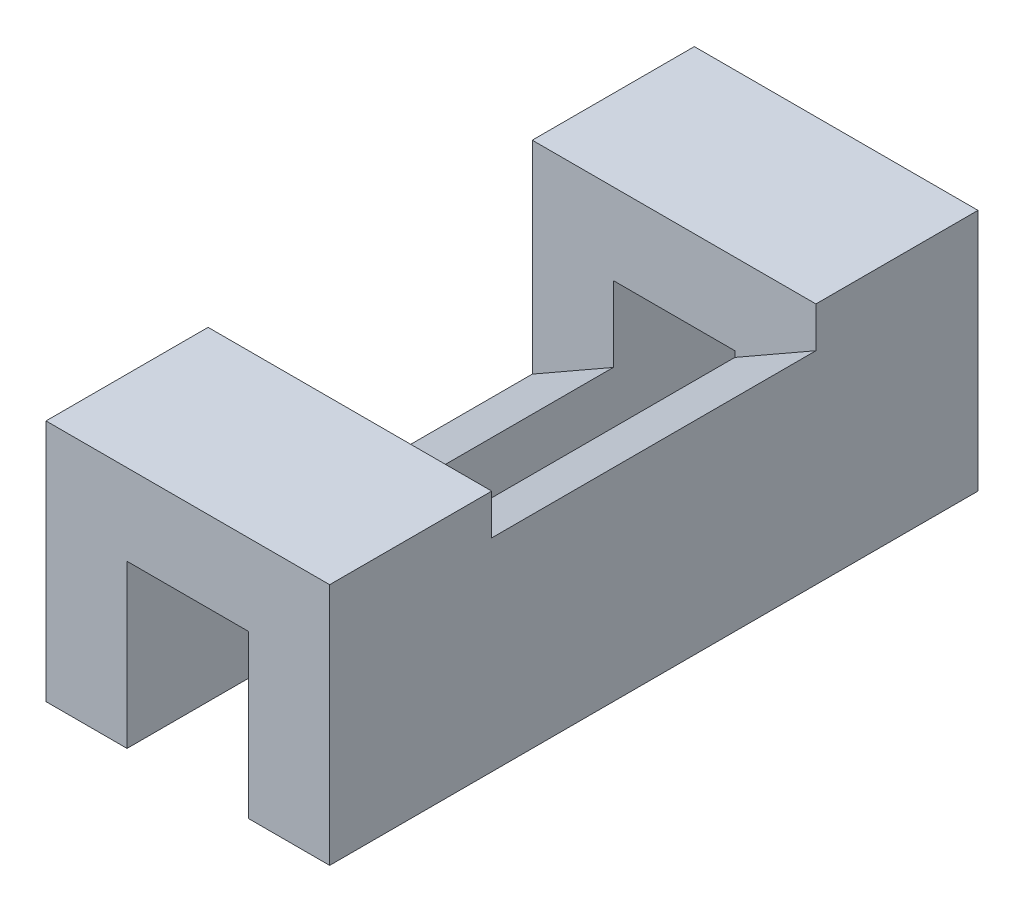
ISO-10303-21;
HEADER;
FILE_DESCRIPTION(('STEP AP214'),'2;1');
FILE_NAME('part.step','',(''),(''),'','','');
FILE_SCHEMA(('AUTOMOTIVE_DESIGN { 1 0 10303 214 1 1 1 1 }'));
ENDSEC;
DATA;
#1=APPLICATION_CONTEXT('core data for automotive mechanical design processes');
#2=APPLICATION_PROTOCOL_DEFINITION('international standard','automotive_design',2000,#1);
#3=PRODUCT_CONTEXT('',#1,'mechanical');
#4=PRODUCT('Part','Part','',(#3));
#5=PRODUCT_RELATED_PRODUCT_CATEGORY('part','',(#4));
#6=PRODUCT_DEFINITION_FORMATION('','',#4);
#7=PRODUCT_DEFINITION_CONTEXT('part definition',#1,'design');
#8=PRODUCT_DEFINITION('design','',#6,#7);
#9=PRODUCT_DEFINITION_SHAPE('','',#8);
#10=(LENGTH_UNIT() NAMED_UNIT(*) SI_UNIT(.MILLI.,.METRE.));
#11=(NAMED_UNIT(*) PLANE_ANGLE_UNIT() SI_UNIT($,.RADIAN.));
#12=(NAMED_UNIT(*) SI_UNIT($,.STERADIAN.) SOLID_ANGLE_UNIT());
#13=UNCERTAINTY_MEASURE_WITH_UNIT(LENGTH_MEASURE(1.E-05),#10,'distance_accuracy_value','');
#14=(GEOMETRIC_REPRESENTATION_CONTEXT(3) GLOBAL_UNCERTAINTY_ASSIGNED_CONTEXT((#13)) GLOBAL_UNIT_ASSIGNED_CONTEXT((#10,
#11,#12)) REPRESENTATION_CONTEXT('',''));
#15=CARTESIAN_POINT('',(0.,0.,0.));
#16=DIRECTION('',(0.,0.,1.));
#17=DIRECTION('',(1.,0.,0.));
#18=AXIS2_PLACEMENT_3D('',#15,#16,#17);
#19=CARTESIAN_POINT('',(-25.,10.7142857142857,20.));
#20=DIRECTION('',(0.496138938356834,-0.868243142124459,0.));
#21=DIRECTION('',(0.868243142124459,0.496138938356834,0.));
#22=AXIS2_PLACEMENT_3D('',#19,#20,#21);
#23=PLANE('',#22);
#24=DIRECTION('',(0.868243142124459,0.496138938356834,0.));
#25=VECTOR('',#24,1.);
#26=CARTESIAN_POINT('',(-25.,10.7142857142857,60.));
#27=LINE('',#26,#25);
#28=CARTESIAN_POINT('',(-35.,5.,60.));
#29=VERTEX_POINT('',#28);
#30=CARTESIAN_POINT('',(-25.,10.7142857142857,60.));
#31=VERTEX_POINT('',#30);
#32=EDGE_CURVE('E52',#29,#31,#27,.T.);
#33=ORIENTED_EDGE('',*,*,#32,.T.);
#34=DIRECTION('',(0.,0.,1.));
#35=VECTOR('',#34,1.);
#36=CARTESIAN_POINT('',(-25.,10.7142857142857,20.));
#37=LINE('',#36,#35);
#38=CARTESIAN_POINT('',(-25.,10.7142857142857,20.));
#39=VERTEX_POINT('',#38);
#40=EDGE_CURVE('E169',#39,#31,#37,.T.);
#41=ORIENTED_EDGE('',*,*,#40,.F.);
#42=DIRECTION('',(0.868243142124459,0.496138938356834,0.));
#43=VECTOR('',#42,1.);
#44=CARTESIAN_POINT('',(-25.,10.7142857142857,20.));
#45=LINE('',#44,#43);
#46=CARTESIAN_POINT('',(-35.,5.,20.));
#47=VERTEX_POINT('',#46);
#48=EDGE_CURVE('E191',#47,#39,#45,.T.);
#49=ORIENTED_EDGE('',*,*,#48,.F.);
#50=DIRECTION('',(0.,0.,1.));
#51=VECTOR('',#50,1.);
#52=CARTESIAN_POINT('',(-35.,5.,20.));
#53=LINE('',#52,#51);
#54=EDGE_CURVE('E48',#47,#29,#53,.T.);
#55=ORIENTED_EDGE('',*,*,#54,.T.);
#56=EDGE_LOOP('',(#33,#41,#49,#55));
#57=FACE_BOUND('',#56,.T.);
#58=ADVANCED_FACE('F33',(#57),#23,.F.);
#59=CARTESIAN_POINT('',(-9.99999999999999,19.2857142857143,20.));
#60=DIRECTION('',(0.496138938356834,-0.868243142124459,0.));
#61=DIRECTION('',(0.868243142124459,0.496138938356834,0.));
#62=AXIS2_PLACEMENT_3D('',#59,#60,#61);
#63=PLANE('',#62);
#64=DIRECTION('',(0.868243142124459,0.496138938356834,0.));
#65=VECTOR('',#64,1.);
#66=CARTESIAN_POINT('',(-9.99999999999999,19.2857142857143,60.));
#67=LINE('',#66,#65);
#68=CARTESIAN_POINT('',(-9.99999999999999,19.2857142857143,60.));
#69=VERTEX_POINT('',#68);
#70=CARTESIAN_POINT('',(0.,25.,60.));
#71=VERTEX_POINT('',#70);
#72=EDGE_CURVE('E175',#69,#71,#67,.T.);
#73=ORIENTED_EDGE('',*,*,#72,.T.);
#74=DIRECTION('',(0.,0.,1.));
#75=VECTOR('',#74,1.);
#76=CARTESIAN_POINT('',(0.,25.,20.));
#77=LINE('',#76,#75);
#78=CARTESIAN_POINT('',(0.,25.,20.));
#79=VERTEX_POINT('',#78);
#80=EDGE_CURVE('E217',#79,#71,#77,.T.);
#81=ORIENTED_EDGE('',*,*,#80,.F.);
#82=DIRECTION('',(0.868243142124459,0.496138938356834,0.));
#83=VECTOR('',#82,1.);
#84=CARTESIAN_POINT('',(-9.99999999999999,19.2857142857143,20.));
#85=LINE('',#84,#83);
#86=CARTESIAN_POINT('',(-9.99999999999999,19.2857142857143,20.));
#87=VERTEX_POINT('',#86);
#88=EDGE_CURVE('E205',#87,#79,#85,.T.);
#89=ORIENTED_EDGE('',*,*,#88,.F.);
#90=DIRECTION('',(0.,0.,1.));
#91=VECTOR('',#90,1.);
#92=CARTESIAN_POINT('',(-9.99999999999999,19.2857142857143,20.));
#93=LINE('',#92,#91);
#94=EDGE_CURVE('E220',#87,#69,#93,.T.);
#95=ORIENTED_EDGE('',*,*,#94,.T.);
#96=EDGE_LOOP('',(#73,#81,#89,#95));
#97=FACE_BOUND('',#96,.T.);
#98=ADVANCED_FACE('F289',(#97),#63,.F.);
#99=CARTESIAN_POINT('',(-25.,20.,80.));
#100=DIRECTION('',(0.,1.,0.));
#101=DIRECTION('',(0.,0.,1.));
#102=AXIS2_PLACEMENT_3D('',#99,#100,#101);
#103=PLANE('',#102);
#104=DIRECTION('',(1.,0.,0.));
#105=VECTOR('',#104,1.);
#106=CARTESIAN_POINT('',(-25.,20.,20.));
#107=LINE('',#106,#105);
#108=CARTESIAN_POINT('',(-25.,20.,20.));
#109=VERTEX_POINT('',#108);
#110=CARTESIAN_POINT('',(-9.99999999999999,20.,20.));
#111=VERTEX_POINT('',#110);
#112=EDGE_CURVE('E200',#109,#111,#107,.T.);
#113=ORIENTED_EDGE('',*,*,#112,.F.);
#114=DIRECTION('',(0.,0.,-1.));
#115=VECTOR('',#114,1.);
#116=CARTESIAN_POINT('',(-25.,20.,80.));
#117=LINE('',#116,#115);
#118=CARTESIAN_POINT('',(-25.,20.,0.));
#119=VERTEX_POINT('',#118);
#120=EDGE_CURVE('E267',#109,#119,#117,.T.);
#121=ORIENTED_EDGE('',*,*,#120,.T.);
#122=DIRECTION('',(1.,0.,0.));
#123=VECTOR('',#122,1.);
#124=CARTESIAN_POINT('',(-25.,20.,0.));
#125=LINE('',#124,#123);
#126=CARTESIAN_POINT('',(-9.99999999999999,20.,0.));
#127=VERTEX_POINT('',#126);
#128=EDGE_CURVE('E244',#119,#127,#125,.T.);
#129=ORIENTED_EDGE('',*,*,#128,.T.);
#130=DIRECTION('',(0.,0.,-1.));
#131=VECTOR('',#130,1.);
#132=CARTESIAN_POINT('',(-9.99999999999999,20.,80.));
#133=LINE('',#132,#131);
#134=EDGE_CURVE('E265',#111,#127,#133,.T.);
#135=ORIENTED_EDGE('',*,*,#134,.F.);
#136=EDGE_LOOP('',(#113,#121,#129,#135));
#137=FACE_BOUND('',#136,.T.);
#138=ADVANCED_FACE('F283',(#137),#103,.F.);
#139=CARTESIAN_POINT('',(0.,30.,80.));
#140=DIRECTION('',(0.,-1.,0.));
#141=DIRECTION('',(0.,0.,-1.));
#142=AXIS2_PLACEMENT_3D('',#139,#140,#141);
#143=PLANE('',#142);
#144=DIRECTION('',(-1.,0.,0.));
#145=VECTOR('',#144,1.);
#146=CARTESIAN_POINT('',(0.,30.,20.));
#147=LINE('',#146,#145);
#148=CARTESIAN_POINT('',(0.,30.,20.));
#149=VERTEX_POINT('',#148);
#150=CARTESIAN_POINT('',(-35.,30.,20.));
#151=VERTEX_POINT('',#150);
#152=EDGE_CURVE('E210',#149,#151,#147,.T.);
#153=ORIENTED_EDGE('',*,*,#152,.F.);
#154=DIRECTION('',(0.,0.,-1.));
#155=VECTOR('',#154,1.);
#156=CARTESIAN_POINT('',(0.,30.,80.));
#157=LINE('',#156,#155);
#158=CARTESIAN_POINT('',(0.,30.,0.));
#159=VERTEX_POINT('',#158);
#160=EDGE_CURVE('E257',#149,#159,#157,.T.);
#161=ORIENTED_EDGE('',*,*,#160,.T.);
#162=DIRECTION('',(-1.,0.,0.));
#163=VECTOR('',#162,1.);
#164=CARTESIAN_POINT('',(0.,30.,0.));
#165=LINE('',#164,#163);
#166=CARTESIAN_POINT('',(-35.,30.,0.));
#167=VERTEX_POINT('',#166);
#168=EDGE_CURVE('E226',#159,#167,#165,.T.);
#169=ORIENTED_EDGE('',*,*,#168,.T.);
#170=DIRECTION('',(0.,0.,-1.));
#171=VECTOR('',#170,1.);
#172=CARTESIAN_POINT('',(-35.,30.,80.));
#173=LINE('',#172,#171);
#174=EDGE_CURVE('E236',#151,#167,#173,.T.);
#175=ORIENTED_EDGE('',*,*,#174,.F.);
#176=EDGE_LOOP('',(#153,#161,#169,#175));
#177=FACE_BOUND('',#176,.T.);
#178=ADVANCED_FACE('F305',(#177),#143,.F.);
#179=CARTESIAN_POINT('',(-35.,30.,80.));
#180=DIRECTION('',(1.,0.,0.));
#181=DIRECTION('',(0.,0.,-1.));
#182=AXIS2_PLACEMENT_3D('',#179,#180,#181);
#183=PLANE('',#182);
#184=DIRECTION('',(0.,-1.,0.));
#185=VECTOR('',#184,1.);
#186=CARTESIAN_POINT('',(-35.,30.,80.));
#187=LINE('',#186,#185);
#188=CARTESIAN_POINT('',(-35.,30.,80.));
#189=VERTEX_POINT('',#188);
#190=CARTESIAN_POINT('',(-35.,0.,80.));
#191=VERTEX_POINT('',#190);
#192=EDGE_CURVE('E223',#189,#191,#187,.T.);
#193=ORIENTED_EDGE('',*,*,#192,.F.);
#194=DIRECTION('',(0.,0.,1.));
#195=VECTOR('',#194,1.);
#196=CARTESIAN_POINT('',(-35.,30.,60.));
#197=LINE('',#196,#195);
#198=CARTESIAN_POINT('',(-35.,30.,60.));
#199=VERTEX_POINT('',#198);
#200=EDGE_CURVE('E188',#199,#189,#197,.T.);
#201=ORIENTED_EDGE('',*,*,#200,.F.);
#202=DIRECTION('',(0.,-1.,0.));
#203=VECTOR('',#202,1.);
#204=CARTESIAN_POINT('',(-35.,30.,60.));
#205=LINE('',#204,#203);
#206=EDGE_CURVE('E156',#199,#29,#205,.T.);
#207=ORIENTED_EDGE('',*,*,#206,.T.);
#208=ORIENTED_EDGE('',*,*,#54,.F.);
#209=DIRECTION('',(0.,-1.,0.));
#210=VECTOR('',#209,1.);
#211=CARTESIAN_POINT('',(-35.,30.,20.));
#212=LINE('',#211,#210);
#213=EDGE_CURVE('E212',#151,#47,#212,.T.);
#214=ORIENTED_EDGE('',*,*,#213,.F.);
#215=ORIENTED_EDGE('',*,*,#174,.T.);
#216=DIRECTION('',(0.,-1.,0.));
#217=VECTOR('',#216,1.);
#218=CARTESIAN_POINT('',(-35.,30.,0.));
#219=LINE('',#218,#217);
#220=CARTESIAN_POINT('',(-35.,0.,0.));
#221=VERTEX_POINT('',#220);
#222=EDGE_CURVE('E216',#167,#221,#219,.T.);
#223=ORIENTED_EDGE('',*,*,#222,.T.);
#224=DIRECTION('',(0.,0.,-1.));
#225=VECTOR('',#224,1.);
#226=CARTESIAN_POINT('',(-35.,0.,80.));
#227=LINE('',#226,#225);
#228=EDGE_CURVE('E11',#191,#221,#227,.T.);
#229=ORIENTED_EDGE('',*,*,#228,.F.);
#230=EDGE_LOOP('',(#193,#201,#207,#208,#214,#215,#223,#229));
#231=FACE_BOUND('',#230,.T.);
#232=ADVANCED_FACE('F35',(#231),#183,.F.);
#233=CARTESIAN_POINT('',(-35.,0.,80.));
#234=DIRECTION('',(0.,1.,0.));
#235=DIRECTION('',(0.,0.,1.));
#236=AXIS2_PLACEMENT_3D('',#233,#234,#235);
#237=PLANE('',#236);
#238=DIRECTION('',(1.,0.,0.));
#239=VECTOR('',#238,1.);
#240=CARTESIAN_POINT('',(-35.,0.,0.));
#241=LINE('',#240,#239);
#242=CARTESIAN_POINT('',(-25.,0.,0.));
#243=VERTEX_POINT('',#242);
#244=EDGE_CURVE('E239',#221,#243,#241,.T.);
#245=ORIENTED_EDGE('',*,*,#244,.T.);
#246=DIRECTION('',(0.,0.,-1.));
#247=VECTOR('',#246,1.);
#248=CARTESIAN_POINT('',(-25.,0.,80.));
#249=LINE('',#248,#247);
#250=CARTESIAN_POINT('',(-25.,0.,80.));
#251=VERTEX_POINT('',#250);
#252=EDGE_CURVE('E41',#251,#243,#249,.T.);
#253=ORIENTED_EDGE('',*,*,#252,.F.);
#254=DIRECTION('',(1.,0.,0.));
#255=VECTOR('',#254,1.);
#256=CARTESIAN_POINT('',(-35.,0.,80.));
#257=LINE('',#256,#255);
#258=EDGE_CURVE('E225',#191,#251,#257,.T.);
#259=ORIENTED_EDGE('',*,*,#258,.F.);
#260=ORIENTED_EDGE('',*,*,#228,.T.);
#261=EDGE_LOOP('',(#245,#253,#259,#260));
#262=FACE_BOUND('',#261,.T.);
#263=ADVANCED_FACE('F323',(#262),#237,.F.);
#264=CARTESIAN_POINT('',(-25.,0.,80.));
#265=DIRECTION('',(-1.,0.,0.));
#266=DIRECTION('',(0.,0.,1.));
#267=AXIS2_PLACEMENT_3D('',#264,#265,#266);
#268=PLANE('',#267);
#269=DIRECTION('',(0.,1.,0.));
#270=VECTOR('',#269,1.);
#271=CARTESIAN_POINT('',(-25.,10.7142857142857,20.));
#272=LINE('',#271,#270);
#273=EDGE_CURVE('E198',#39,#109,#272,.T.);
#274=ORIENTED_EDGE('',*,*,#273,.F.);
#275=ORIENTED_EDGE('',*,*,#40,.T.);
#276=DIRECTION('',(0.,1.,0.));
#277=VECTOR('',#276,1.);
#278=CARTESIAN_POINT('',(-25.,10.7142857142857,60.));
#279=LINE('',#278,#277);
#280=CARTESIAN_POINT('',(-25.,20.,60.));
#281=VERTEX_POINT('',#280);
#282=EDGE_CURVE('E162',#31,#281,#279,.T.);
#283=ORIENTED_EDGE('',*,*,#282,.T.);
#284=DIRECTION('',(0.,0.,1.));
#285=VECTOR('',#284,1.);
#286=CARTESIAN_POINT('',(-25.,20.,60.));
#287=LINE('',#286,#285);
#288=CARTESIAN_POINT('',(-25.,20.,80.));
#289=VERTEX_POINT('',#288);
#290=EDGE_CURVE('E145',#281,#289,#287,.T.);
#291=ORIENTED_EDGE('',*,*,#290,.T.);
#292=DIRECTION('',(0.,1.,0.));
#293=VECTOR('',#292,1.);
#294=CARTESIAN_POINT('',(-25.,0.,80.));
#295=LINE('',#294,#293);
#296=EDGE_CURVE('E228',#251,#289,#295,.T.);
#297=ORIENTED_EDGE('',*,*,#296,.F.);
#298=ORIENTED_EDGE('',*,*,#252,.T.);
#299=DIRECTION('',(0.,1.,0.));
#300=VECTOR('',#299,1.);
#301=CARTESIAN_POINT('',(-25.,0.,0.));
#302=LINE('',#301,#300);
#303=EDGE_CURVE('E241',#243,#119,#302,.T.);
#304=ORIENTED_EDGE('',*,*,#303,.T.);
#305=ORIENTED_EDGE('',*,*,#120,.F.);
#306=EDGE_LOOP('',(#274,#275,#283,#291,#297,#298,#304,#305));
#307=FACE_BOUND('',#306,.T.);
#308=ADVANCED_FACE('F168',(#307),#268,.F.);
#309=CARTESIAN_POINT('',(-9.99999999999999,20.,80.));
#310=DIRECTION('',(1.,0.,0.));
#311=DIRECTION('',(0.,1.,0.));
#312=AXIS2_PLACEMENT_3D('',#309,#310,#311);
#313=PLANE('',#312);
#314=DIRECTION('',(0.,-1.,0.));
#315=VECTOR('',#314,1.);
#316=CARTESIAN_POINT('',(-9.99999999999999,20.,80.));
#317=LINE('',#316,#315);
#318=CARTESIAN_POINT('',(-9.99999999999999,20.,80.));
#319=VERTEX_POINT('',#318);
#320=CARTESIAN_POINT('',(-9.99999999999999,0.,80.));
#321=VERTEX_POINT('',#320);
#322=EDGE_CURVE('E230',#319,#321,#317,.T.);
#323=ORIENTED_EDGE('',*,*,#322,.F.);
#324=DIRECTION('',(0.,0.,1.));
#325=VECTOR('',#324,1.);
#326=CARTESIAN_POINT('',(-9.99999999999999,20.,60.));
#327=LINE('',#326,#325);
#328=CARTESIAN_POINT('',(-9.99999999999999,20.,60.));
#329=VERTEX_POINT('',#328);
#330=EDGE_CURVE('E155',#329,#319,#327,.T.);
#331=ORIENTED_EDGE('',*,*,#330,.F.);
#332=DIRECTION('',(0.,-1.,0.));
#333=VECTOR('',#332,1.);
#334=CARTESIAN_POINT('',(-9.99999999999999,20.,60.));
#335=LINE('',#334,#333);
#336=EDGE_CURVE('E165',#329,#69,#335,.T.);
#337=ORIENTED_EDGE('',*,*,#336,.T.);
#338=ORIENTED_EDGE('',*,*,#94,.F.);
#339=DIRECTION('',(0.,-1.,0.));
#340=VECTOR('',#339,1.);
#341=CARTESIAN_POINT('',(-9.99999999999999,20.,20.));
#342=LINE('',#341,#340);
#343=EDGE_CURVE('E202',#111,#87,#342,.T.);
#344=ORIENTED_EDGE('',*,*,#343,.F.);
#345=ORIENTED_EDGE('',*,*,#134,.T.);
#346=DIRECTION('',(0.,-1.,0.));
#347=VECTOR('',#346,1.);
#348=CARTESIAN_POINT('',(-9.99999999999999,20.,0.));
#349=LINE('',#348,#347);
#350=CARTESIAN_POINT('',(-9.99999999999999,0.,0.));
#351=VERTEX_POINT('',#350);
#352=EDGE_CURVE('E247',#127,#351,#349,.T.);
#353=ORIENTED_EDGE('',*,*,#352,.T.);
#354=DIRECTION('',(0.,0.,-1.));
#355=VECTOR('',#354,1.);
#356=CARTESIAN_POINT('',(-9.99999999999999,0.,80.));
#357=LINE('',#356,#355);
#358=EDGE_CURVE('E262',#321,#351,#357,.T.);
#359=ORIENTED_EDGE('',*,*,#358,.F.);
#360=EDGE_LOOP('',(#323,#331,#337,#338,#344,#345,#353,#359));
#361=FACE_BOUND('',#360,.T.);
#362=ADVANCED_FACE('F315',(#361),#313,.F.);
#363=CARTESIAN_POINT('',(-9.99999999999999,0.,80.));
#364=DIRECTION('',(0.,1.,0.));
#365=DIRECTION('',(0.,0.,1.));
#366=AXIS2_PLACEMENT_3D('',#363,#364,#365);
#367=PLANE('',#366);
#368=DIRECTION('',(1.,0.,0.));
#369=VECTOR('',#368,1.);
#370=CARTESIAN_POINT('',(-9.99999999999999,0.,0.));
#371=LINE('',#370,#369);
#372=CARTESIAN_POINT('',(0.,0.,0.));
#373=VERTEX_POINT('',#372);
#374=EDGE_CURVE('E249',#351,#373,#371,.T.);
#375=ORIENTED_EDGE('',*,*,#374,.T.);
#376=DIRECTION('',(0.,0.,-1.));
#377=VECTOR('',#376,1.);
#378=CARTESIAN_POINT('',(0.,0.,80.));
#379=LINE('',#378,#377);
#380=CARTESIAN_POINT('',(0.,0.,80.));
#381=VERTEX_POINT('',#380);
#382=EDGE_CURVE('E259',#381,#373,#379,.T.);
#383=ORIENTED_EDGE('',*,*,#382,.F.);
#384=DIRECTION('',(1.,0.,0.));
#385=VECTOR('',#384,1.);
#386=CARTESIAN_POINT('',(-9.99999999999999,0.,80.));
#387=LINE('',#386,#385);
#388=EDGE_CURVE('E232',#321,#381,#387,.T.);
#389=ORIENTED_EDGE('',*,*,#388,.F.);
#390=ORIENTED_EDGE('',*,*,#358,.T.);
#391=EDGE_LOOP('',(#375,#383,#389,#390));
#392=FACE_BOUND('',#391,.T.);
#393=ADVANCED_FACE('F311',(#392),#367,.F.);
#394=CARTESIAN_POINT('',(0.,0.,80.));
#395=DIRECTION('',(-1.,0.,0.));
#396=DIRECTION('',(0.,0.,1.));
#397=AXIS2_PLACEMENT_3D('',#394,#395,#396);
#398=PLANE('',#397);
#399=DIRECTION('',(0.,1.,0.));
#400=VECTOR('',#399,1.);
#401=CARTESIAN_POINT('',(0.,25.,20.));
#402=LINE('',#401,#400);
#403=EDGE_CURVE('E208',#79,#149,#402,.T.);
#404=ORIENTED_EDGE('',*,*,#403,.F.);
#405=ORIENTED_EDGE('',*,*,#80,.T.);
#406=DIRECTION('',(0.,1.,0.));
#407=VECTOR('',#406,1.);
#408=CARTESIAN_POINT('',(0.,25.,60.));
#409=LINE('',#408,#407);
#410=CARTESIAN_POINT('',(0.,30.,60.));
#411=VERTEX_POINT('',#410);
#412=EDGE_CURVE('E177',#71,#411,#409,.T.);
#413=ORIENTED_EDGE('',*,*,#412,.T.);
#414=DIRECTION('',(0.,0.,1.));
#415=VECTOR('',#414,1.);
#416=CARTESIAN_POINT('',(0.,30.,60.));
#417=LINE('',#416,#415);
#418=CARTESIAN_POINT('',(0.,30.,80.));
#419=VERTEX_POINT('',#418);
#420=EDGE_CURVE('E192',#411,#419,#417,.T.);
#421=ORIENTED_EDGE('',*,*,#420,.T.);
#422=DIRECTION('',(0.,1.,0.));
#423=VECTOR('',#422,1.);
#424=CARTESIAN_POINT('',(0.,0.,80.));
#425=LINE('',#424,#423);
#426=EDGE_CURVE('E234',#381,#419,#425,.T.);
#427=ORIENTED_EDGE('',*,*,#426,.F.);
#428=ORIENTED_EDGE('',*,*,#382,.T.);
#429=DIRECTION('',(0.,1.,0.));
#430=VECTOR('',#429,1.);
#431=CARTESIAN_POINT('',(0.,0.,0.));
#432=LINE('',#431,#430);
#433=EDGE_CURVE('E251',#373,#159,#432,.T.);
#434=ORIENTED_EDGE('',*,*,#433,.T.);
#435=ORIENTED_EDGE('',*,*,#160,.F.);
#436=EDGE_LOOP('',(#404,#405,#413,#421,#427,#428,#434,#435));
#437=FACE_BOUND('',#436,.T.);
#438=ADVANCED_FACE('F301',(#437),#398,.F.);
#439=CARTESIAN_POINT('',(0.,0.,80.));
#440=DIRECTION('',(0.,0.,1.));
#441=DIRECTION('',(1.,0.,0.));
#442=AXIS2_PLACEMENT_3D('',#439,#440,#441);
#443=PLANE('',#442);
#444=ORIENTED_EDGE('',*,*,#426,.T.);
#445=DIRECTION('',(-1.,0.,0.));
#446=VECTOR('',#445,1.);
#447=CARTESIAN_POINT('',(0.,30.,80.));
#448=LINE('',#447,#446);
#449=EDGE_CURVE('E171',#419,#189,#448,.T.);
#450=ORIENTED_EDGE('',*,*,#449,.T.);
#451=ORIENTED_EDGE('',*,*,#192,.T.);
#452=ORIENTED_EDGE('',*,*,#258,.T.);
#453=ORIENTED_EDGE('',*,*,#296,.T.);
#454=DIRECTION('',(1.,0.,0.));
#455=VECTOR('',#454,1.);
#456=CARTESIAN_POINT('',(-25.,20.,80.));
#457=LINE('',#456,#455);
#458=EDGE_CURVE('E151',#289,#319,#457,.T.);
#459=ORIENTED_EDGE('',*,*,#458,.T.);
#460=ORIENTED_EDGE('',*,*,#322,.T.);
#461=ORIENTED_EDGE('',*,*,#388,.T.);
#462=EDGE_LOOP('',(#444,#450,#451,#452,#453,#459,#460,#461));
#463=FACE_BOUND('',#462,.T.);
#464=ADVANCED_FACE('F298',(#463),#443,.T.);
#465=CARTESIAN_POINT('',(0.,0.,0.));
#466=DIRECTION('',(0.,0.,1.));
#467=DIRECTION('',(1.,0.,0.));
#468=AXIS2_PLACEMENT_3D('',#465,#466,#467);
#469=PLANE('',#468);
#470=ORIENTED_EDGE('',*,*,#222,.F.);
#471=ORIENTED_EDGE('',*,*,#168,.F.);
#472=ORIENTED_EDGE('',*,*,#433,.F.);
#473=ORIENTED_EDGE('',*,*,#374,.F.);
#474=ORIENTED_EDGE('',*,*,#352,.F.);
#475=ORIENTED_EDGE('',*,*,#128,.F.);
#476=ORIENTED_EDGE('',*,*,#303,.F.);
#477=ORIENTED_EDGE('',*,*,#244,.F.);
#478=EDGE_LOOP('',(#470,#471,#472,#473,#474,#475,#476,#477));
#479=FACE_BOUND('',#478,.T.);
#480=ADVANCED_FACE('F277',(#479),#469,.F.);
#481=CARTESIAN_POINT('',(0.,0.,20.));
#482=DIRECTION('',(0.,0.,1.));
#483=DIRECTION('',(1.,0.,0.));
#484=AXIS2_PLACEMENT_3D('',#481,#482,#483);
#485=PLANE('',#484);
#486=ORIENTED_EDGE('',*,*,#48,.T.);
#487=ORIENTED_EDGE('',*,*,#273,.T.);
#488=ORIENTED_EDGE('',*,*,#112,.T.);
#489=ORIENTED_EDGE('',*,*,#343,.T.);
#490=ORIENTED_EDGE('',*,*,#88,.T.);
#491=ORIENTED_EDGE('',*,*,#403,.T.);
#492=ORIENTED_EDGE('',*,*,#152,.T.);
#493=ORIENTED_EDGE('',*,*,#213,.T.);
#494=EDGE_LOOP('',(#486,#487,#488,#489,#490,#491,#492,#493));
#495=FACE_BOUND('',#494,.T.);
#496=ADVANCED_FACE('F285',(#495),#485,.T.);
#497=CARTESIAN_POINT('',(0.,30.,60.));
#498=DIRECTION('',(0.,1.,0.));
#499=DIRECTION('',(0.,0.,1.));
#500=AXIS2_PLACEMENT_3D('',#497,#498,#499);
#501=PLANE('',#500);
#502=ORIENTED_EDGE('',*,*,#449,.F.);
#503=ORIENTED_EDGE('',*,*,#420,.F.);
#504=DIRECTION('',(-1.,0.,0.));
#505=VECTOR('',#504,1.);
#506=CARTESIAN_POINT('',(0.,30.,60.));
#507=LINE('',#506,#505);
#508=EDGE_CURVE('E180',#411,#199,#507,.T.);
#509=ORIENTED_EDGE('',*,*,#508,.T.);
#510=ORIENTED_EDGE('',*,*,#200,.T.);
#511=EDGE_LOOP('',(#502,#503,#509,#510));
#512=FACE_BOUND('',#511,.T.);
#513=ADVANCED_FACE('F346',(#512),#501,.T.);
#514=CARTESIAN_POINT('',(-25.,20.,60.));
#515=DIRECTION('',(0.,-1.,0.));
#516=DIRECTION('',(0.,0.,-1.));
#517=AXIS2_PLACEMENT_3D('',#514,#515,#516);
#518=PLANE('',#517);
#519=ORIENTED_EDGE('',*,*,#458,.F.);
#520=ORIENTED_EDGE('',*,*,#290,.F.);
#521=DIRECTION('',(1.,0.,0.));
#522=VECTOR('',#521,1.);
#523=CARTESIAN_POINT('',(-25.,20.,60.));
#524=LINE('',#523,#522);
#525=EDGE_CURVE('E149',#281,#329,#524,.T.);
#526=ORIENTED_EDGE('',*,*,#525,.T.);
#527=ORIENTED_EDGE('',*,*,#330,.T.);
#528=EDGE_LOOP('',(#519,#520,#526,#527));
#529=FACE_BOUND('',#528,.T.);
#530=ADVANCED_FACE('F147',(#529),#518,.T.);
#531=CARTESIAN_POINT('',(0.,0.,60.));
#532=DIRECTION('',(0.,0.,1.));
#533=DIRECTION('',(1.,0.,0.));
#534=AXIS2_PLACEMENT_3D('',#531,#532,#533);
#535=PLANE('',#534);
#536=ORIENTED_EDGE('',*,*,#32,.F.);
#537=ORIENTED_EDGE('',*,*,#206,.F.);
#538=ORIENTED_EDGE('',*,*,#508,.F.);
#539=ORIENTED_EDGE('',*,*,#412,.F.);
#540=ORIENTED_EDGE('',*,*,#72,.F.);
#541=ORIENTED_EDGE('',*,*,#336,.F.);
#542=ORIENTED_EDGE('',*,*,#525,.F.);
#543=ORIENTED_EDGE('',*,*,#282,.F.);
#544=EDGE_LOOP('',(#536,#537,#538,#539,#540,#541,#542,#543));
#545=FACE_BOUND('',#544,.T.);
#546=ADVANCED_FACE('F161',(#545),#535,.F.);
#547=CLOSED_SHELL('',(#58,#98,#138,#178,#232,#263,#308,#362,#393,#438,#464,#480,#496,#513,#530,#546));
#548=MANIFOLD_SOLID_BREP('B2',#547);
#549=ADVANCED_BREP_SHAPE_REPRESENTATION('',(#18,#548),#14);
#550=SHAPE_DEFINITION_REPRESENTATION(#9,#549);
ENDSEC;
END-ISO-10303-21;
